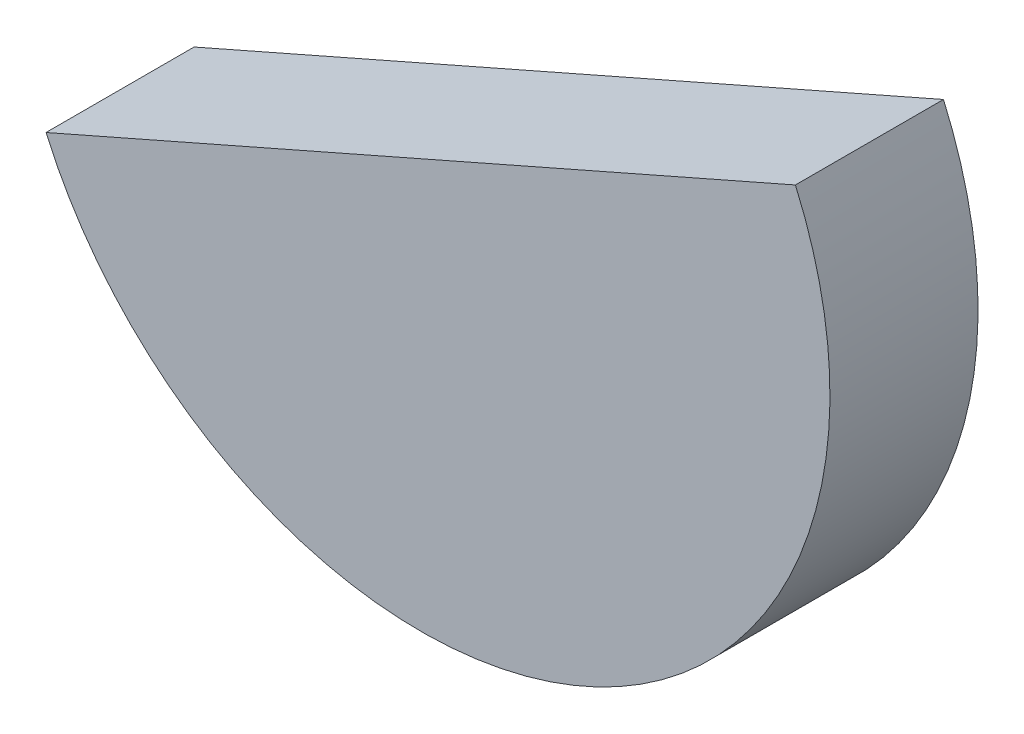
ISO-10303-21;
HEADER;
FILE_DESCRIPTION(('STEP AP214'),'2;1');
FILE_NAME('part.step','',(''),(''),'','','');
FILE_SCHEMA(('AUTOMOTIVE_DESIGN { 1 0 10303 214 1 1 1 1 }'));
ENDSEC;
DATA;
#1=APPLICATION_CONTEXT('core data for automotive mechanical design processes');
#2=APPLICATION_PROTOCOL_DEFINITION('international standard','automotive_design',2000,#1);
#3=PRODUCT_CONTEXT('',#1,'mechanical');
#4=PRODUCT('Part','Part','',(#3));
#5=PRODUCT_RELATED_PRODUCT_CATEGORY('part','',(#4));
#6=PRODUCT_DEFINITION_FORMATION('','',#4);
#7=PRODUCT_DEFINITION_CONTEXT('part definition',#1,'design');
#8=PRODUCT_DEFINITION('design','',#6,#7);
#9=PRODUCT_DEFINITION_SHAPE('','',#8);
#10=(LENGTH_UNIT() NAMED_UNIT(*) SI_UNIT(.MILLI.,.METRE.));
#11=(NAMED_UNIT(*) PLANE_ANGLE_UNIT() SI_UNIT($,.RADIAN.));
#12=(NAMED_UNIT(*) SI_UNIT($,.STERADIAN.) SOLID_ANGLE_UNIT());
#13=UNCERTAINTY_MEASURE_WITH_UNIT(LENGTH_MEASURE(1.E-05),#10,'distance_accuracy_value','');
#14=(GEOMETRIC_REPRESENTATION_CONTEXT(3) GLOBAL_UNCERTAINTY_ASSIGNED_CONTEXT((#13)) GLOBAL_UNIT_ASSIGNED_CONTEXT((#10,
#11,#12)) REPRESENTATION_CONTEXT('',''));
#15=CARTESIAN_POINT('',(0.,0.,0.));
#16=DIRECTION('',(0.,0.,1.));
#17=DIRECTION('',(1.,0.,0.));
#18=AXIS2_PLACEMENT_3D('',#15,#16,#17);
#19=CARTESIAN_POINT('',(-5.137,13.719,7.139));
#20=DIRECTION('',(0.,0.,-1.));
#21=DIRECTION('',(-1.,0.,0.));
#22=AXIS2_PLACEMENT_3D('',#19,#20,#21);
#23=CYLINDRICAL_SURFACE('',#22,19.731);
#24=CARTESIAN_POINT('',(-5.137,13.719,0.));
#25=DIRECTION('',(0.,0.,1.));
#26=DIRECTION('',(-1.,0.,0.));
#27=AXIS2_PLACEMENT_3D('',#24,#25,#26);
#28=CIRCLE('',#27,19.731);
#29=CARTESIAN_POINT('',(-23.2013076725018,5.78217763124361,0.));
#30=VERTEX_POINT('',#29);
#31=CARTESIAN_POINT('',(12.9273076725018,21.6558223687564,0.));
#32=VERTEX_POINT('',#31);
#33=EDGE_CURVE('E74',#30,#32,#28,.T.);
#34=ORIENTED_EDGE('',*,*,#33,.T.);
#35=DIRECTION('',(0.,0.,-1.));
#36=VECTOR('',#35,1.);
#37=CARTESIAN_POINT('',(12.9273076725018,21.6558223687564,7.139));
#38=LINE('',#37,#36);
#39=CARTESIAN_POINT('',(12.9273076725018,21.6558223687564,7.139));
#40=VERTEX_POINT('',#39);
#41=EDGE_CURVE('E11',#40,#32,#38,.T.);
#42=ORIENTED_EDGE('',*,*,#41,.F.);
#43=CARTESIAN_POINT('',(-5.137,13.719,7.139));
#44=DIRECTION('',(0.,0.,1.));
#45=DIRECTION('',(-1.,0.,0.));
#46=AXIS2_PLACEMENT_3D('',#43,#44,#45);
#47=CIRCLE('',#46,19.731);
#48=CARTESIAN_POINT('',(-23.2013076725018,5.78217763124361,7.139));
#49=VERTEX_POINT('',#48);
#50=EDGE_CURVE('E72',#49,#40,#47,.T.);
#51=ORIENTED_EDGE('',*,*,#50,.F.);
#52=DIRECTION('',(0.,0.,-1.));
#53=VECTOR('',#52,1.);
#54=CARTESIAN_POINT('',(-23.2013076725018,5.78217763124361,7.139));
#55=LINE('',#54,#53);
#56=EDGE_CURVE('E47',#49,#30,#55,.T.);
#57=ORIENTED_EDGE('',*,*,#56,.T.);
#58=EDGE_LOOP('',(#34,#42,#51,#57));
#59=FACE_BOUND('',#58,.T.);
#60=ADVANCED_FACE('F41',(#59),#23,.T.);
#61=CARTESIAN_POINT('',(-23.2013076725018,5.78217763124361,7.139));
#62=DIRECTION('',(0.402251399764654,-0.915529252065371,0.));
#63=DIRECTION('',(0.915529252065371,0.402251399764654,0.));
#64=AXIS2_PLACEMENT_3D('',#61,#62,#63);
#65=PLANE('',#64);
#66=DIRECTION('',(-0.915529252065371,-0.402251399764654,0.));
#67=VECTOR('',#66,1.);
#68=CARTESIAN_POINT('',(-23.2013076725018,5.78217763124361,0.));
#69=LINE('',#68,#67);
#70=EDGE_CURVE('E61',#32,#30,#69,.T.);
#71=ORIENTED_EDGE('',*,*,#70,.T.);
#72=ORIENTED_EDGE('',*,*,#56,.F.);
#73=DIRECTION('',(-0.915529252065371,-0.402251399764654,0.));
#74=VECTOR('',#73,1.);
#75=CARTESIAN_POINT('',(-23.2013076725018,5.78217763124361,7.139));
#76=LINE('',#75,#74);
#77=EDGE_CURVE('E57',#40,#49,#76,.T.);
#78=ORIENTED_EDGE('',*,*,#77,.F.);
#79=ORIENTED_EDGE('',*,*,#41,.T.);
#80=EDGE_LOOP('',(#71,#72,#78,#79));
#81=FACE_BOUND('',#80,.T.);
#82=ADVANCED_FACE('F70',(#81),#65,.F.);
#83=CARTESIAN_POINT('',(-5.137,13.719,7.139));
#84=DIRECTION('',(0.,0.,-1.));
#85=DIRECTION('',(-1.,0.,0.));
#86=AXIS2_PLACEMENT_3D('',#83,#84,#85);
#87=PLANE('',#86);
#88=ORIENTED_EDGE('',*,*,#50,.T.);
#89=ORIENTED_EDGE('',*,*,#77,.T.);
#90=EDGE_LOOP('',(#88,#89));
#91=FACE_BOUND('',#90,.T.);
#92=ADVANCED_FACE('F80',(#91),#87,.F.);
#93=CARTESIAN_POINT('',(-5.137,13.719,0.));
#94=DIRECTION('',(0.,0.,-1.));
#95=DIRECTION('',(-1.,0.,0.));
#96=AXIS2_PLACEMENT_3D('',#93,#94,#95);
#97=PLANE('',#96);
#98=ORIENTED_EDGE('',*,*,#33,.F.);
#99=ORIENTED_EDGE('',*,*,#70,.F.);
#100=EDGE_LOOP('',(#98,#99));
#101=FACE_BOUND('',#100,.T.);
#102=ADVANCED_FACE('F73',(#101),#97,.T.);
#103=CLOSED_SHELL('',(#60,#82,#92,#102));
#104=MANIFOLD_SOLID_BREP('B2',#103);
#105=ADVANCED_BREP_SHAPE_REPRESENTATION('',(#18,#104),#14);
#106=SHAPE_DEFINITION_REPRESENTATION(#9,#105);
ENDSEC;
END-ISO-10303-21;
